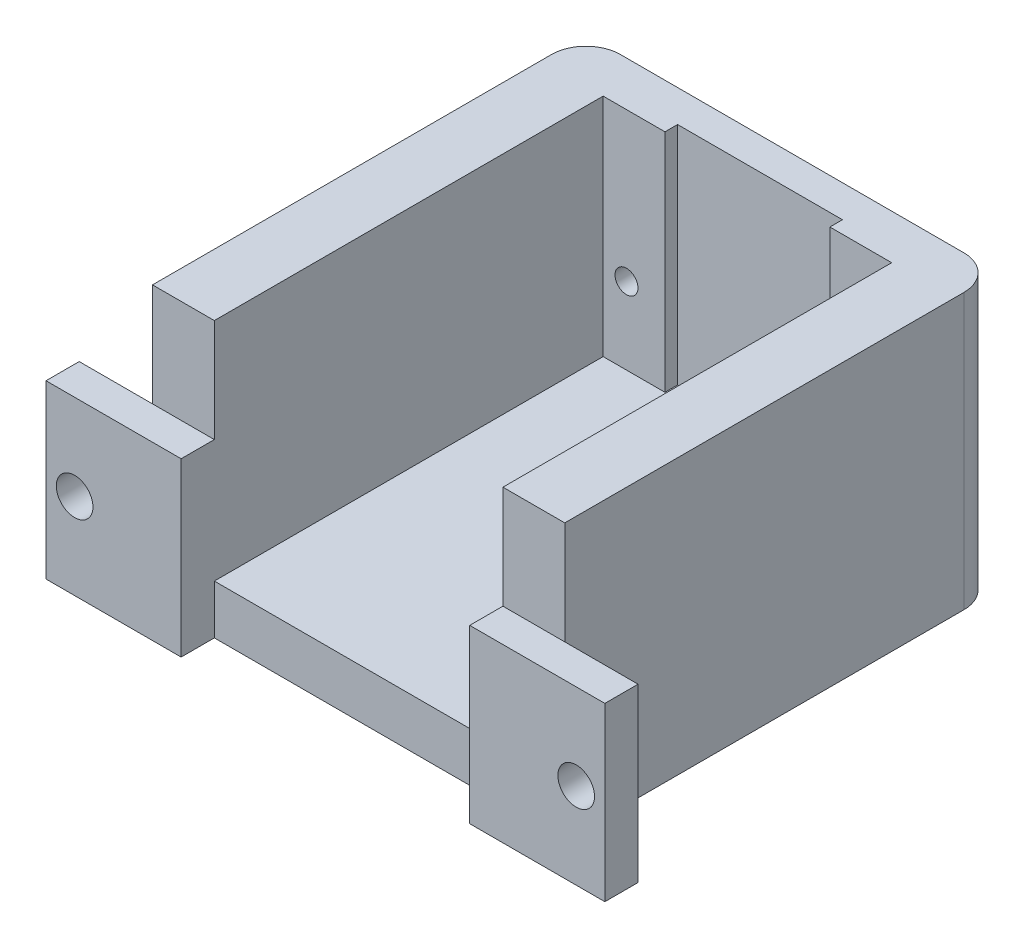
ISO-10303-21;
HEADER;
FILE_DESCRIPTION(('STEP AP214'),'2;1');
FILE_NAME('part.step','',(''),(''),'','','');
FILE_SCHEMA(('AUTOMOTIVE_DESIGN { 1 0 10303 214 1 1 1 1 }'));
ENDSEC;
DATA;
#1=APPLICATION_CONTEXT('core data for automotive mechanical design processes');
#2=APPLICATION_PROTOCOL_DEFINITION('international standard','automotive_design',2000,#1);
#3=PRODUCT_CONTEXT('',#1,'mechanical');
#4=PRODUCT('Part','Part','',(#3));
#5=PRODUCT_RELATED_PRODUCT_CATEGORY('part','',(#4));
#6=PRODUCT_DEFINITION_FORMATION('','',#4);
#7=PRODUCT_DEFINITION_CONTEXT('part definition',#1,'design');
#8=PRODUCT_DEFINITION('design','',#6,#7);
#9=PRODUCT_DEFINITION_SHAPE('','',#8);
#10=(LENGTH_UNIT() NAMED_UNIT(*) SI_UNIT(.MILLI.,.METRE.));
#11=(NAMED_UNIT(*) PLANE_ANGLE_UNIT() SI_UNIT($,.RADIAN.));
#12=(NAMED_UNIT(*) SI_UNIT($,.STERADIAN.) SOLID_ANGLE_UNIT());
#13=UNCERTAINTY_MEASURE_WITH_UNIT(LENGTH_MEASURE(1.E-05),#10,'distance_accuracy_value','');
#14=(GEOMETRIC_REPRESENTATION_CONTEXT(3) GLOBAL_UNCERTAINTY_ASSIGNED_CONTEXT((#13)) GLOBAL_UNIT_ASSIGNED_CONTEXT((#10,
#11,#12)) REPRESENTATION_CONTEXT('',''));
#15=CARTESIAN_POINT('',(0.,0.,0.));
#16=DIRECTION('',(0.,0.,1.));
#17=DIRECTION('',(1.,0.,0.));
#18=AXIS2_PLACEMENT_3D('',#15,#16,#17);
#19=CARTESIAN_POINT('',(-9.29999999999999,9.3,17.85));
#20=DIRECTION('',(0.,0.,1.));
#21=DIRECTION('',(1.,0.,0.));
#22=AXIS2_PLACEMENT_3D('',#19,#20,#21);
#23=PLANE('',#22);
#24=DIRECTION('',(1.,0.,0.));
#25=VECTOR('',#24,1.);
#26=CARTESIAN_POINT('',(-12.4,4.3,17.85));
#27=LINE('',#26,#25);
#28=CARTESIAN_POINT('',(-12.6,4.3,17.85));
#29=VERTEX_POINT('',#28);
#30=CARTESIAN_POINT('',(12.6,4.3,17.85));
#31=VERTEX_POINT('',#30);
#32=EDGE_CURVE('E190',#29,#31,#27,.T.);
#33=ORIENTED_EDGE('',*,*,#32,.F.);
#34=DIRECTION('',(0.,1.,0.));
#35=VECTOR('',#34,1.);
#36=CARTESIAN_POINT('',(-12.6,-25.3663162481272,17.85));
#37=LINE('',#36,#35);
#38=CARTESIAN_POINT('',(-12.6,0.,17.85));
#39=VERTEX_POINT('',#38);
#40=EDGE_CURVE('E192',#39,#29,#37,.T.);
#41=ORIENTED_EDGE('',*,*,#40,.F.);
#42=DIRECTION('',(-1.,0.,0.));
#43=VECTOR('',#42,1.);
#44=CARTESIAN_POINT('',(0.,0.,17.85));
#45=LINE('',#44,#43);
#46=CARTESIAN_POINT('',(12.6,0.,17.85));
#47=VERTEX_POINT('',#46);
#48=EDGE_CURVE('E344',#47,#39,#45,.T.);
#49=ORIENTED_EDGE('',*,*,#48,.F.);
#50=DIRECTION('',(0.,1.,0.));
#51=VECTOR('',#50,1.);
#52=CARTESIAN_POINT('',(12.6,-25.3663162481272,17.85));
#53=LINE('',#52,#51);
#54=EDGE_CURVE('E194',#47,#31,#53,.T.);
#55=ORIENTED_EDGE('',*,*,#54,.T.);
#56=EDGE_LOOP('',(#33,#41,#49,#55));
#57=FACE_BOUND('',#56,.T.);
#58=ADVANCED_FACE('F34',(#57),#23,.T.);
#59=DIRECTION('',(0.,-1.,0.));
#60=VECTOR('',#59,1.);
#61=CARTESIAN_POINT('',(-12.6,9.3,17.85));
#62=LINE('',#61,#60);
#63=CARTESIAN_POINT('',(-12.6,24.,17.85));
#64=VERTEX_POINT('',#63);
#65=CARTESIAN_POINT('',(-12.6,15.,17.85));
#66=VERTEX_POINT('',#65);
#67=EDGE_CURVE('E412',#64,#66,#62,.T.);
#68=ORIENTED_EDGE('',*,*,#67,.F.);
#69=DIRECTION('',(-1.,0.,0.));
#70=VECTOR('',#69,1.);
#71=CARTESIAN_POINT('',(0.,24.,17.85));
#72=LINE('',#71,#70);
#73=CARTESIAN_POINT('',(-18.,24.,17.85));
#74=VERTEX_POINT('',#73);
#75=EDGE_CURVE('E198',#64,#74,#72,.T.);
#76=ORIENTED_EDGE('',*,*,#75,.T.);
#77=DIRECTION('',(0.,-1.,0.));
#78=VECTOR('',#77,1.);
#79=CARTESIAN_POINT('',(-18.,24.,17.85));
#80=LINE('',#79,#78);
#81=CARTESIAN_POINT('',(-18.,15.,17.85));
#82=VERTEX_POINT('',#81);
#83=EDGE_CURVE('E346',#74,#82,#80,.T.);
#84=ORIENTED_EDGE('',*,*,#83,.T.);
#85=DIRECTION('',(1.,0.,0.));
#86=VECTOR('',#85,1.);
#87=CARTESIAN_POINT('',(-12.4,15.,17.85));
#88=LINE('',#87,#86);
#89=EDGE_CURVE('E394',#82,#66,#88,.T.);
#90=ORIENTED_EDGE('',*,*,#89,.T.);
#91=EDGE_LOOP('',(#68,#76,#84,#90));
#92=FACE_BOUND('',#91,.T.);
#93=ADVANCED_FACE('F443',(#92),#23,.T.);
#94=CARTESIAN_POINT('',(0.,24.,0.));
#95=DIRECTION('',(0.,-1.,0.));
#96=DIRECTION('',(0.,0.,-1.));
#97=AXIS2_PLACEMENT_3D('',#94,#95,#96);
#98=PLANE('',#97);
#99=DIRECTION('',(0.,0.,-1.));
#100=VECTOR('',#99,1.);
#101=CARTESIAN_POINT('',(18.,24.,25.));
#102=LINE('',#101,#100);
#103=CARTESIAN_POINT('',(18.,24.,17.85));
#104=VERTEX_POINT('',#103);
#105=CARTESIAN_POINT('',(18.,24.,-17.));
#106=VERTEX_POINT('',#105);
#107=EDGE_CURVE('E290',#104,#106,#102,.T.);
#108=ORIENTED_EDGE('',*,*,#107,.T.);
#109=CARTESIAN_POINT('',(15.,24.,-17.));
#110=DIRECTION('',(0.,-1.,0.));
#111=DIRECTION('',(0.,0.,-1.));
#112=AXIS2_PLACEMENT_3D('',#109,#110,#111);
#113=CIRCLE('',#112,3.);
#114=CARTESIAN_POINT('',(15.,24.,-20.));
#115=VERTEX_POINT('',#114);
#116=EDGE_CURVE('E42',#106,#115,#113,.F.);
#117=ORIENTED_EDGE('',*,*,#116,.T.);
#118=DIRECTION('',(1.,0.,0.));
#119=VECTOR('',#118,1.);
#120=CARTESIAN_POINT('',(0.,24.,-20.));
#121=LINE('',#120,#119);
#122=CARTESIAN_POINT('',(-15.,24.,-20.));
#123=VERTEX_POINT('',#122);
#124=EDGE_CURVE('E274',#123,#115,#121,.T.);
#125=ORIENTED_EDGE('',*,*,#124,.F.);
#126=CARTESIAN_POINT('',(-15.,24.,-17.));
#127=DIRECTION('',(0.,-1.,0.));
#128=DIRECTION('',(0.,0.,-1.));
#129=AXIS2_PLACEMENT_3D('',#126,#127,#128);
#130=CIRCLE('',#129,3.);
#131=CARTESIAN_POINT('',(-18.,24.,-17.));
#132=VERTEX_POINT('',#131);
#133=EDGE_CURVE('E49',#123,#132,#130,.F.);
#134=ORIENTED_EDGE('',*,*,#133,.T.);
#135=DIRECTION('',(0.,0.,1.));
#136=VECTOR('',#135,1.);
#137=CARTESIAN_POINT('',(-18.,24.,25.));
#138=LINE('',#137,#136);
#139=EDGE_CURVE('E292',#132,#74,#138,.T.);
#140=ORIENTED_EDGE('',*,*,#139,.T.);
#141=ORIENTED_EDGE('',*,*,#75,.F.);
#142=DIRECTION('',(0.,0.,1.));
#143=VECTOR('',#142,1.);
#144=CARTESIAN_POINT('',(-12.6,24.,-16.1));
#145=LINE('',#144,#143);
#146=CARTESIAN_POINT('',(-12.6,24.,-16.1));
#147=VERTEX_POINT('',#146);
#148=EDGE_CURVE('E238',#147,#64,#145,.T.);
#149=ORIENTED_EDGE('',*,*,#148,.F.);
#150=DIRECTION('',(-1.,0.,0.));
#151=VECTOR('',#150,1.);
#152=CARTESIAN_POINT('',(-7.2,24.,-16.1));
#153=LINE('',#152,#151);
#154=CARTESIAN_POINT('',(-7.2,24.,-16.1));
#155=VERTEX_POINT('',#154);
#156=EDGE_CURVE('E215',#155,#147,#153,.T.);
#157=ORIENTED_EDGE('',*,*,#156,.F.);
#158=DIRECTION('',(0.,0.,1.));
#159=VECTOR('',#158,1.);
#160=CARTESIAN_POINT('',(-7.2,24.,-17.2));
#161=LINE('',#160,#159);
#162=CARTESIAN_POINT('',(-7.2,24.,-17.2));
#163=VERTEX_POINT('',#162);
#164=EDGE_CURVE('E220',#163,#155,#161,.T.);
#165=ORIENTED_EDGE('',*,*,#164,.F.);
#166=DIRECTION('',(-1.,0.,0.));
#167=VECTOR('',#166,1.);
#168=CARTESIAN_POINT('',(7.2,24.,-17.2));
#169=LINE('',#168,#167);
#170=CARTESIAN_POINT('',(7.2,24.,-17.2));
#171=VERTEX_POINT('',#170);
#172=EDGE_CURVE('E250',#171,#163,#169,.T.);
#173=ORIENTED_EDGE('',*,*,#172,.F.);
#174=DIRECTION('',(0.,0.,-1.));
#175=VECTOR('',#174,1.);
#176=CARTESIAN_POINT('',(7.2,24.,-16.1));
#177=LINE('',#176,#175);
#178=CARTESIAN_POINT('',(7.2,24.,-16.1));
#179=VERTEX_POINT('',#178);
#180=EDGE_CURVE('E247',#179,#171,#177,.T.);
#181=ORIENTED_EDGE('',*,*,#180,.F.);
#182=DIRECTION('',(-1.,0.,0.));
#183=VECTOR('',#182,1.);
#184=CARTESIAN_POINT('',(12.6,24.,-16.1));
#185=LINE('',#184,#183);
#186=CARTESIAN_POINT('',(12.6,24.,-16.1));
#187=VERTEX_POINT('',#186);
#188=EDGE_CURVE('E244',#187,#179,#185,.T.);
#189=ORIENTED_EDGE('',*,*,#188,.F.);
#190=DIRECTION('',(0.,0.,-1.));
#191=VECTOR('',#190,1.);
#192=CARTESIAN_POINT('',(12.6,24.,16.1));
#193=LINE('',#192,#191);
#194=CARTESIAN_POINT('',(12.6,24.,17.85));
#195=VERTEX_POINT('',#194);
#196=EDGE_CURVE('E240',#195,#187,#193,.T.);
#197=ORIENTED_EDGE('',*,*,#196,.F.);
#198=EDGE_CURVE('E241',#104,#195,#72,.T.);
#199=ORIENTED_EDGE('',*,*,#198,.F.);
#200=EDGE_LOOP('',(#108,#117,#125,#134,#140,#141,#149,#157,#165,#173,#181,#189,#197,#199));
#201=FACE_BOUND('',#200,.T.);
#202=ADVANCED_FACE('F322',(#201),#98,.F.);
#203=CARTESIAN_POINT('',(18.,24.,25.));
#204=DIRECTION('',(-1.,0.,0.));
#205=DIRECTION('',(0.,0.,1.));
#206=AXIS2_PLACEMENT_3D('',#203,#204,#205);
#207=PLANE('',#206);
#208=DIRECTION('',(0.,0.,-1.));
#209=VECTOR('',#208,1.);
#210=CARTESIAN_POINT('',(18.,0.,25.));
#211=LINE('',#210,#209);
#212=CARTESIAN_POINT('',(18.,0.,17.85));
#213=VERTEX_POINT('',#212);
#214=CARTESIAN_POINT('',(18.,0.,-17.));
#215=VERTEX_POINT('',#214);
#216=EDGE_CURVE('E287',#213,#215,#211,.T.);
#217=ORIENTED_EDGE('',*,*,#216,.T.);
#218=DIRECTION('',(0.,-1.,0.));
#219=VECTOR('',#218,1.);
#220=CARTESIAN_POINT('',(18.,24.,-17.));
#221=LINE('',#220,#219);
#222=EDGE_CURVE('E57',#215,#106,#221,.F.);
#223=ORIENTED_EDGE('',*,*,#222,.T.);
#224=ORIENTED_EDGE('',*,*,#107,.F.);
#225=DIRECTION('',(0.,1.,0.));
#226=VECTOR('',#225,1.);
#227=CARTESIAN_POINT('',(18.,24.,17.85));
#228=LINE('',#227,#226);
#229=CARTESIAN_POINT('',(18.,15.,17.85));
#230=VERTEX_POINT('',#229);
#231=EDGE_CURVE('E338',#230,#104,#228,.T.);
#232=ORIENTED_EDGE('',*,*,#231,.F.);
#233=EDGE_CURVE('E223',#213,#230,#228,.T.);
#234=ORIENTED_EDGE('',*,*,#233,.F.);
#235=EDGE_LOOP('',(#217,#223,#224,#232,#234));
#236=FACE_BOUND('',#235,.T.);
#237=ADVANCED_FACE('F335',(#236),#207,.F.);
#238=CARTESIAN_POINT('',(-18.,24.,25.));
#239=DIRECTION('',(1.,0.,0.));
#240=DIRECTION('',(0.,0.,-1.));
#241=AXIS2_PLACEMENT_3D('',#238,#239,#240);
#242=PLANE('',#241);
#243=ORIENTED_EDGE('',*,*,#139,.F.);
#244=DIRECTION('',(0.,1.,0.));
#245=VECTOR('',#244,1.);
#246=CARTESIAN_POINT('',(-18.,0.,-17.));
#247=LINE('',#246,#245);
#248=CARTESIAN_POINT('',(-18.,0.,-17.));
#249=VERTEX_POINT('',#248);
#250=EDGE_CURVE('E11',#132,#249,#247,.F.);
#251=ORIENTED_EDGE('',*,*,#250,.T.);
#252=DIRECTION('',(0.,0.,1.));
#253=VECTOR('',#252,1.);
#254=CARTESIAN_POINT('',(-18.,0.,25.));
#255=LINE('',#254,#253);
#256=CARTESIAN_POINT('',(-18.,0.,17.85));
#257=VERTEX_POINT('',#256);
#258=EDGE_CURVE('E293',#249,#257,#255,.T.);
#259=ORIENTED_EDGE('',*,*,#258,.T.);
#260=DIRECTION('',(0.,-1.,0.));
#261=VECTOR('',#260,1.);
#262=CARTESIAN_POINT('',(-18.,24.,17.85));
#263=LINE('',#262,#261);
#264=EDGE_CURVE('E374',#82,#257,#263,.T.);
#265=ORIENTED_EDGE('',*,*,#264,.F.);
#266=ORIENTED_EDGE('',*,*,#83,.F.);
#267=EDGE_LOOP('',(#243,#251,#259,#265,#266));
#268=FACE_BOUND('',#267,.T.);
#269=ADVANCED_FACE('F438',(#268),#242,.F.);
#270=CARTESIAN_POINT('',(0.,0.,0.));
#271=DIRECTION('',(0.,-1.,0.));
#272=DIRECTION('',(0.,0.,-1.));
#273=AXIS2_PLACEMENT_3D('',#270,#271,#272);
#274=PLANE('',#273);
#275=DIRECTION('',(1.,0.,0.));
#276=VECTOR('',#275,1.);
#277=CARTESIAN_POINT('',(0.,0.,-20.));
#278=LINE('',#277,#276);
#279=CARTESIAN_POINT('',(-15.,0.,-20.));
#280=VERTEX_POINT('',#279);
#281=CARTESIAN_POINT('',(15.,0.,-20.));
#282=VERTEX_POINT('',#281);
#283=EDGE_CURVE('E270',#280,#282,#278,.T.);
#284=ORIENTED_EDGE('',*,*,#283,.T.);
#285=CARTESIAN_POINT('',(15.,0.,-17.));
#286=DIRECTION('',(0.,-1.,0.));
#287=DIRECTION('',(0.,0.,-1.));
#288=AXIS2_PLACEMENT_3D('',#285,#286,#287);
#289=CIRCLE('',#288,3.);
#290=EDGE_CURVE('E318',#282,#215,#289,.T.);
#291=ORIENTED_EDGE('',*,*,#290,.T.);
#292=ORIENTED_EDGE('',*,*,#216,.F.);
#293=DIRECTION('',(1.,0.,0.));
#294=VECTOR('',#293,1.);
#295=CARTESIAN_POINT('',(12.4,0.,17.85));
#296=LINE('',#295,#294);
#297=CARTESIAN_POINT('',(24.4,0.,17.85));
#298=VERTEX_POINT('',#297);
#299=EDGE_CURVE('E363',#213,#298,#296,.T.);
#300=ORIENTED_EDGE('',*,*,#299,.T.);
#301=DIRECTION('',(0.,0.,-1.));
#302=VECTOR('',#301,1.);
#303=CARTESIAN_POINT('',(24.4,0.,20.75));
#304=LINE('',#303,#302);
#305=CARTESIAN_POINT('',(24.4,0.,20.75));
#306=VERTEX_POINT('',#305);
#307=EDGE_CURVE('E199',#306,#298,#304,.T.);
#308=ORIENTED_EDGE('',*,*,#307,.F.);
#309=DIRECTION('',(1.,0.,0.));
#310=VECTOR('',#309,1.);
#311=CARTESIAN_POINT('',(12.4,0.,20.75));
#312=LINE('',#311,#310);
#313=CARTESIAN_POINT('',(12.6,0.,20.75));
#314=VERTEX_POINT('',#313);
#315=EDGE_CURVE('E360',#314,#306,#312,.T.);
#316=ORIENTED_EDGE('',*,*,#315,.F.);
#317=DIRECTION('',(0.,0.,-1.));
#318=VECTOR('',#317,1.);
#319=CARTESIAN_POINT('',(12.6,0.,17.85));
#320=LINE('',#319,#318);
#321=EDGE_CURVE('E416',#314,#47,#320,.T.);
#322=ORIENTED_EDGE('',*,*,#321,.T.);
#323=ORIENTED_EDGE('',*,*,#48,.T.);
#324=DIRECTION('',(0.,0.,1.));
#325=VECTOR('',#324,1.);
#326=CARTESIAN_POINT('',(-12.6,0.,17.85));
#327=LINE('',#326,#325);
#328=CARTESIAN_POINT('',(-12.6,0.,20.75));
#329=VERTEX_POINT('',#328);
#330=EDGE_CURVE('E208',#39,#329,#327,.T.);
#331=ORIENTED_EDGE('',*,*,#330,.T.);
#332=DIRECTION('',(-1.,0.,0.));
#333=VECTOR('',#332,1.);
#334=CARTESIAN_POINT('',(-12.4,0.,20.75));
#335=LINE('',#334,#333);
#336=CARTESIAN_POINT('',(-24.4,0.,20.75));
#337=VERTEX_POINT('',#336);
#338=EDGE_CURVE('E384',#329,#337,#335,.T.);
#339=ORIENTED_EDGE('',*,*,#338,.T.);
#340=DIRECTION('',(0.,0.,-1.));
#341=VECTOR('',#340,1.);
#342=CARTESIAN_POINT('',(-24.4,0.,20.75));
#343=LINE('',#342,#341);
#344=CARTESIAN_POINT('',(-24.4,0.,17.85));
#345=VERTEX_POINT('',#344);
#346=EDGE_CURVE('E381',#337,#345,#343,.T.);
#347=ORIENTED_EDGE('',*,*,#346,.T.);
#348=DIRECTION('',(-1.,0.,0.));
#349=VECTOR('',#348,1.);
#350=CARTESIAN_POINT('',(-12.4,0.,17.85));
#351=LINE('',#350,#349);
#352=EDGE_CURVE('E385',#257,#345,#351,.T.);
#353=ORIENTED_EDGE('',*,*,#352,.F.);
#354=ORIENTED_EDGE('',*,*,#258,.F.);
#355=CARTESIAN_POINT('',(-15.,0.,-17.));
#356=DIRECTION('',(0.,-1.,0.));
#357=DIRECTION('',(0.,0.,-1.));
#358=AXIS2_PLACEMENT_3D('',#355,#356,#357);
#359=CIRCLE('',#358,3.);
#360=EDGE_CURVE('E316',#249,#280,#359,.T.);
#361=ORIENTED_EDGE('',*,*,#360,.T.);
#362=EDGE_LOOP('',(#284,#291,#292,#300,#308,#316,#322,#323,#331,#339,#347,#353,#354,#361));
#363=FACE_BOUND('',#362,.T.);
#364=ADVANCED_FACE('F333',(#363),#274,.T.);
#365=CARTESIAN_POINT('',(-10.56,11.,-17.6));
#366=DIRECTION('',(0.,0.,-1.));
#367=DIRECTION('',(-1.,0.,0.));
#368=AXIS2_PLACEMENT_3D('',#365,#366,#367);
#369=CYLINDRICAL_SURFACE('',#368,2.);
#370=CARTESIAN_POINT('',(-10.56,11.,-17.6));
#371=DIRECTION('',(0.,0.,-1.));
#372=DIRECTION('',(-1.,0.,0.));
#373=AXIS2_PLACEMENT_3D('',#370,#371,#372);
#374=CIRCLE('',#373,2.);
#375=CARTESIAN_POINT('',(-12.56,11.,-17.6));
#376=VERTEX_POINT('',#375);
#377=EDGE_CURVE('E281',#376,#376,#374,.T.);
#378=ORIENTED_EDGE('',*,*,#377,.F.);
#379=EDGE_LOOP('',(#378));
#380=FACE_BOUND('',#379,.T.);
#381=CARTESIAN_POINT('',(-10.56,11.,-20.));
#382=DIRECTION('',(0.,0.,-1.));
#383=DIRECTION('',(-1.,0.,0.));
#384=AXIS2_PLACEMENT_3D('',#381,#382,#383);
#385=CIRCLE('',#384,2.);
#386=CARTESIAN_POINT('',(-12.56,11.,-20.));
#387=VERTEX_POINT('',#386);
#388=EDGE_CURVE('E267',#387,#387,#385,.F.);
#389=ORIENTED_EDGE('',*,*,#388,.F.);
#390=EDGE_LOOP('',(#389));
#391=FACE_BOUND('',#390,.T.);
#392=ADVANCED_FACE('F548',(#380,#391),#369,.F.);
#393=CARTESIAN_POINT('',(10.565,11.,-17.6));
#394=DIRECTION('',(0.,0.,-1.));
#395=DIRECTION('',(-1.,0.,0.));
#396=AXIS2_PLACEMENT_3D('',#393,#394,#395);
#397=CYLINDRICAL_SURFACE('',#396,2.);
#398=CARTESIAN_POINT('',(10.565,11.,-17.6));
#399=DIRECTION('',(0.,0.,-1.));
#400=DIRECTION('',(-1.,0.,0.));
#401=AXIS2_PLACEMENT_3D('',#398,#399,#400);
#402=CIRCLE('',#401,2.);
#403=CARTESIAN_POINT('',(8.56500000000001,11.,-17.6));
#404=VERTEX_POINT('',#403);
#405=EDGE_CURVE('E284',#404,#404,#402,.T.);
#406=ORIENTED_EDGE('',*,*,#405,.F.);
#407=EDGE_LOOP('',(#406));
#408=FACE_BOUND('',#407,.T.);
#409=CARTESIAN_POINT('',(10.565,11.,-20.));
#410=DIRECTION('',(0.,0.,-1.));
#411=DIRECTION('',(-1.,0.,0.));
#412=AXIS2_PLACEMENT_3D('',#409,#410,#411);
#413=CIRCLE('',#412,2.);
#414=CARTESIAN_POINT('',(8.56500000000001,11.,-20.));
#415=VERTEX_POINT('',#414);
#416=EDGE_CURVE('E271',#415,#415,#413,.F.);
#417=ORIENTED_EDGE('',*,*,#416,.F.);
#418=EDGE_LOOP('',(#417));
#419=FACE_BOUND('',#418,.T.);
#420=ADVANCED_FACE('F545',(#408,#419),#397,.F.);
#421=CARTESIAN_POINT('',(-10.56,11.,-17.6));
#422=DIRECTION('',(0.,0.,-1.));
#423=DIRECTION('',(-1.,0.,0.));
#424=AXIS2_PLACEMENT_3D('',#421,#422,#423);
#425=PLANE('',#424);
#426=CARTESIAN_POINT('',(-10.56,11.,-17.6));
#427=DIRECTION('',(0.,0.,-1.));
#428=DIRECTION('',(-1.,0.,0.));
#429=AXIS2_PLACEMENT_3D('',#426,#427,#428);
#430=CIRCLE('',#429,1.);
#431=CARTESIAN_POINT('',(-11.56,11.,-17.6));
#432=VERTEX_POINT('',#431);
#433=EDGE_CURVE('E278',#432,#432,#430,.T.);
#434=ORIENTED_EDGE('',*,*,#433,.F.);
#435=EDGE_LOOP('',(#434));
#436=FACE_BOUND('',#435,.T.);
#437=ORIENTED_EDGE('',*,*,#377,.T.);
#438=EDGE_LOOP('',(#437));
#439=FACE_BOUND('',#438,.T.);
#440=ADVANCED_FACE('F543',(#436,#439),#425,.T.);
#441=CARTESIAN_POINT('',(10.565,11.,-17.6));
#442=DIRECTION('',(0.,0.,-1.));
#443=DIRECTION('',(-1.,0.,0.));
#444=AXIS2_PLACEMENT_3D('',#441,#442,#443);
#445=PLANE('',#444);
#446=CARTESIAN_POINT('',(10.565,11.,-17.6));
#447=DIRECTION('',(0.,0.,-1.));
#448=DIRECTION('',(-1.,0.,0.));
#449=AXIS2_PLACEMENT_3D('',#446,#447,#448);
#450=CIRCLE('',#449,1.);
#451=CARTESIAN_POINT('',(9.56500000000001,11.,-17.6));
#452=VERTEX_POINT('',#451);
#453=EDGE_CURVE('E277',#452,#452,#450,.T.);
#454=ORIENTED_EDGE('',*,*,#453,.F.);
#455=EDGE_LOOP('',(#454));
#456=FACE_BOUND('',#455,.T.);
#457=ORIENTED_EDGE('',*,*,#405,.T.);
#458=EDGE_LOOP('',(#457));
#459=FACE_BOUND('',#458,.T.);
#460=ADVANCED_FACE('F539',(#456,#459),#445,.T.);
#461=CARTESIAN_POINT('',(10.565,11.,-10.2));
#462=DIRECTION('',(0.,0.,-1.));
#463=DIRECTION('',(-1.,0.,0.));
#464=AXIS2_PLACEMENT_3D('',#461,#462,#463);
#465=CYLINDRICAL_SURFACE('',#464,1.);
#466=CARTESIAN_POINT('',(10.565,11.,-16.1));
#467=DIRECTION('',(0.,0.,-1.));
#468=DIRECTION('',(-1.,0.,0.));
#469=AXIS2_PLACEMENT_3D('',#466,#467,#468);
#470=CIRCLE('',#469,1.);
#471=CARTESIAN_POINT('',(9.56500000000001,11.,-16.1));
#472=VERTEX_POINT('',#471);
#473=EDGE_CURVE('E300',#472,#472,#470,.F.);
#474=ORIENTED_EDGE('',*,*,#473,.T.);
#475=EDGE_LOOP('',(#474));
#476=FACE_BOUND('',#475,.T.);
#477=ORIENTED_EDGE('',*,*,#453,.T.);
#478=EDGE_LOOP('',(#477));
#479=FACE_BOUND('',#478,.T.);
#480=ADVANCED_FACE('F535',(#476,#479),#465,.F.);
#481=CARTESIAN_POINT('',(-10.56,11.,-10.2));
#482=DIRECTION('',(0.,0.,-1.));
#483=DIRECTION('',(-1.,0.,0.));
#484=AXIS2_PLACEMENT_3D('',#481,#482,#483);
#485=CYLINDRICAL_SURFACE('',#484,1.);
#486=CARTESIAN_POINT('',(-10.56,11.,-16.1));
#487=DIRECTION('',(0.,0.,-1.));
#488=DIRECTION('',(-1.,0.,0.));
#489=AXIS2_PLACEMENT_3D('',#486,#487,#488);
#490=CIRCLE('',#489,1.);
#491=CARTESIAN_POINT('',(-11.56,11.,-16.1));
#492=VERTEX_POINT('',#491);
#493=EDGE_CURVE('E257',#492,#492,#490,.F.);
#494=ORIENTED_EDGE('',*,*,#493,.T.);
#495=EDGE_LOOP('',(#494));
#496=FACE_BOUND('',#495,.T.);
#497=ORIENTED_EDGE('',*,*,#433,.T.);
#498=EDGE_LOOP('',(#497));
#499=FACE_BOUND('',#498,.T.);
#500=ADVANCED_FACE('F531',(#496,#499),#485,.F.);
#501=CARTESIAN_POINT('',(0.,0.,-20.));
#502=DIRECTION('',(0.,0.,-1.));
#503=DIRECTION('',(-1.,0.,0.));
#504=AXIS2_PLACEMENT_3D('',#501,#502,#503);
#505=PLANE('',#504);
#506=ORIENTED_EDGE('',*,*,#388,.T.);
#507=EDGE_LOOP('',(#506));
#508=FACE_BOUND('',#507,.T.);
#509=ORIENTED_EDGE('',*,*,#416,.T.);
#510=EDGE_LOOP('',(#509));
#511=FACE_BOUND('',#510,.T.);
#512=ORIENTED_EDGE('',*,*,#124,.T.);
#513=DIRECTION('',(0.,-1.,0.));
#514=VECTOR('',#513,1.);
#515=CARTESIAN_POINT('',(15.,0.,-20.));
#516=LINE('',#515,#514);
#517=EDGE_CURVE('E313',#115,#282,#516,.T.);
#518=ORIENTED_EDGE('',*,*,#517,.T.);
#519=ORIENTED_EDGE('',*,*,#283,.F.);
#520=DIRECTION('',(0.,1.,0.));
#521=VECTOR('',#520,1.);
#522=CARTESIAN_POINT('',(-15.,24.,-20.));
#523=LINE('',#522,#521);
#524=EDGE_CURVE('E310',#280,#123,#523,.T.);
#525=ORIENTED_EDGE('',*,*,#524,.T.);
#526=EDGE_LOOP('',(#512,#518,#519,#525));
#527=FACE_BOUND('',#526,.T.);
#528=ADVANCED_FACE('F327',(#508,#511,#527),#505,.T.);
#529=CARTESIAN_POINT('',(12.6,4.3,-16.1));
#530=DIRECTION('',(0.,0.,-1.));
#531=DIRECTION('',(-1.,0.,0.));
#532=AXIS2_PLACEMENT_3D('',#529,#530,#531);
#533=PLANE('',#532);
#534=ORIENTED_EDGE('',*,*,#188,.T.);
#535=DIRECTION('',(0.,1.,0.));
#536=VECTOR('',#535,1.);
#537=CARTESIAN_POINT('',(7.2,4.3,-16.1));
#538=LINE('',#537,#536);
#539=CARTESIAN_POINT('',(7.2,4.3,-16.1));
#540=VERTEX_POINT('',#539);
#541=EDGE_CURVE('E264',#540,#179,#538,.T.);
#542=ORIENTED_EDGE('',*,*,#541,.F.);
#543=DIRECTION('',(-1.,0.,0.));
#544=VECTOR('',#543,1.);
#545=CARTESIAN_POINT('',(12.6,4.3,-16.1));
#546=LINE('',#545,#544);
#547=CARTESIAN_POINT('',(12.6,4.3,-16.1));
#548=VERTEX_POINT('',#547);
#549=EDGE_CURVE('E217',#548,#540,#546,.T.);
#550=ORIENTED_EDGE('',*,*,#549,.F.);
#551=DIRECTION('',(0.,1.,0.));
#552=VECTOR('',#551,1.);
#553=CARTESIAN_POINT('',(12.6,4.3,-16.1));
#554=LINE('',#553,#552);
#555=EDGE_CURVE('E237',#548,#187,#554,.T.);
#556=ORIENTED_EDGE('',*,*,#555,.T.);
#557=EDGE_LOOP('',(#534,#542,#550,#556));
#558=FACE_BOUND('',#557,.T.);
#559=ORIENTED_EDGE('',*,*,#473,.F.);
#560=EDGE_LOOP('',(#559));
#561=FACE_BOUND('',#560,.T.);
#562=ADVANCED_FACE('F497',(#558,#561),#533,.F.);
#563=CARTESIAN_POINT('',(-7.2,4.3,-16.1));
#564=DIRECTION('',(0.,0.,-1.));
#565=DIRECTION('',(-1.,0.,0.));
#566=AXIS2_PLACEMENT_3D('',#563,#564,#565);
#567=PLANE('',#566);
#568=ORIENTED_EDGE('',*,*,#156,.T.);
#569=DIRECTION('',(0.,1.,0.));
#570=VECTOR('',#569,1.);
#571=CARTESIAN_POINT('',(-12.6,4.3,-16.1));
#572=LINE('',#571,#570);
#573=CARTESIAN_POINT('',(-12.6,4.3,-16.1));
#574=VERTEX_POINT('',#573);
#575=EDGE_CURVE('E255',#574,#147,#572,.T.);
#576=ORIENTED_EDGE('',*,*,#575,.F.);
#577=DIRECTION('',(-1.,0.,0.));
#578=VECTOR('',#577,1.);
#579=CARTESIAN_POINT('',(-7.2,4.3,-16.1));
#580=LINE('',#579,#578);
#581=CARTESIAN_POINT('',(-7.2,4.3,-16.1));
#582=VERTEX_POINT('',#581);
#583=EDGE_CURVE('E213',#582,#574,#580,.T.);
#584=ORIENTED_EDGE('',*,*,#583,.F.);
#585=DIRECTION('',(0.,1.,0.));
#586=VECTOR('',#585,1.);
#587=CARTESIAN_POINT('',(-7.2,4.3,-16.1));
#588=LINE('',#587,#586);
#589=EDGE_CURVE('E258',#582,#155,#588,.T.);
#590=ORIENTED_EDGE('',*,*,#589,.T.);
#591=EDGE_LOOP('',(#568,#576,#584,#590));
#592=FACE_BOUND('',#591,.T.);
#593=ORIENTED_EDGE('',*,*,#493,.F.);
#594=EDGE_LOOP('',(#593));
#595=FACE_BOUND('',#594,.T.);
#596=ADVANCED_FACE('F510',(#592,#595),#567,.F.);
#597=CARTESIAN_POINT('',(-12.6,4.3,-16.1));
#598=DIRECTION('',(-1.,0.,0.));
#599=DIRECTION('',(0.,0.,1.));
#600=AXIS2_PLACEMENT_3D('',#597,#598,#599);
#601=PLANE('',#600);
#602=ORIENTED_EDGE('',*,*,#148,.T.);
#603=ORIENTED_EDGE('',*,*,#67,.T.);
#604=DIRECTION('',(0.,0.,1.));
#605=VECTOR('',#604,1.);
#606=CARTESIAN_POINT('',(-12.6,15.,20.75));
#607=LINE('',#606,#605);
#608=CARTESIAN_POINT('',(-12.6,15.,20.75));
#609=VERTEX_POINT('',#608);
#610=EDGE_CURVE('E414',#66,#609,#607,.T.);
#611=ORIENTED_EDGE('',*,*,#610,.T.);
#612=DIRECTION('',(0.,-1.,0.));
#613=VECTOR('',#612,1.);
#614=CARTESIAN_POINT('',(-12.6,0.,20.75));
#615=LINE('',#614,#613);
#616=EDGE_CURVE('E305',#609,#329,#615,.T.);
#617=ORIENTED_EDGE('',*,*,#616,.T.);
#618=ORIENTED_EDGE('',*,*,#330,.F.);
#619=ORIENTED_EDGE('',*,*,#40,.T.);
#620=DIRECTION('',(0.,0.,1.));
#621=VECTOR('',#620,1.);
#622=CARTESIAN_POINT('',(-12.6,4.3,-16.1));
#623=LINE('',#622,#621);
#624=EDGE_CURVE('E205',#574,#29,#623,.T.);
#625=ORIENTED_EDGE('',*,*,#624,.F.);
#626=ORIENTED_EDGE('',*,*,#575,.T.);
#627=EDGE_LOOP('',(#602,#603,#611,#617,#618,#619,#625,#626));
#628=FACE_BOUND('',#627,.T.);
#629=ADVANCED_FACE('F204',(#628),#601,.F.);
#630=CARTESIAN_POINT('',(-7.2,4.3,-17.2));
#631=DIRECTION('',(-1.,0.,0.));
#632=DIRECTION('',(0.,0.,1.));
#633=AXIS2_PLACEMENT_3D('',#630,#631,#632);
#634=PLANE('',#633);
#635=ORIENTED_EDGE('',*,*,#164,.T.);
#636=ORIENTED_EDGE('',*,*,#589,.F.);
#637=DIRECTION('',(0.,0.,1.));
#638=VECTOR('',#637,1.);
#639=CARTESIAN_POINT('',(-7.2,4.3,-17.2));
#640=LINE('',#639,#638);
#641=CARTESIAN_POINT('',(-7.2,4.3,-17.2));
#642=VERTEX_POINT('',#641);
#643=EDGE_CURVE('E234',#642,#582,#640,.T.);
#644=ORIENTED_EDGE('',*,*,#643,.F.);
#645=DIRECTION('',(0.,1.,0.));
#646=VECTOR('',#645,1.);
#647=CARTESIAN_POINT('',(-7.2,4.3,-17.2));
#648=LINE('',#647,#646);
#649=EDGE_CURVE('E260',#642,#163,#648,.T.);
#650=ORIENTED_EDGE('',*,*,#649,.T.);
#651=EDGE_LOOP('',(#635,#636,#644,#650));
#652=FACE_BOUND('',#651,.T.);
#653=ADVANCED_FACE('F513',(#652),#634,.F.);
#654=CARTESIAN_POINT('',(7.2,4.3,-17.2));
#655=DIRECTION('',(0.,0.,-1.));
#656=DIRECTION('',(-1.,0.,0.));
#657=AXIS2_PLACEMENT_3D('',#654,#655,#656);
#658=PLANE('',#657);
#659=ORIENTED_EDGE('',*,*,#172,.T.);
#660=ORIENTED_EDGE('',*,*,#649,.F.);
#661=DIRECTION('',(-1.,0.,0.));
#662=VECTOR('',#661,1.);
#663=CARTESIAN_POINT('',(7.2,4.3,-17.2));
#664=LINE('',#663,#662);
#665=CARTESIAN_POINT('',(7.2,4.3,-17.2));
#666=VERTEX_POINT('',#665);
#667=EDGE_CURVE('E231',#666,#642,#664,.T.);
#668=ORIENTED_EDGE('',*,*,#667,.F.);
#669=DIRECTION('',(0.,1.,0.));
#670=VECTOR('',#669,1.);
#671=CARTESIAN_POINT('',(7.2,4.3,-17.2));
#672=LINE('',#671,#670);
#673=EDGE_CURVE('E262',#666,#171,#672,.T.);
#674=ORIENTED_EDGE('',*,*,#673,.T.);
#675=EDGE_LOOP('',(#659,#660,#668,#674));
#676=FACE_BOUND('',#675,.T.);
#677=ADVANCED_FACE('F506',(#676),#658,.F.);
#678=CARTESIAN_POINT('',(7.2,4.3,-16.1));
#679=DIRECTION('',(1.,0.,0.));
#680=DIRECTION('',(0.,0.,-1.));
#681=AXIS2_PLACEMENT_3D('',#678,#679,#680);
#682=PLANE('',#681);
#683=ORIENTED_EDGE('',*,*,#180,.T.);
#684=ORIENTED_EDGE('',*,*,#673,.F.);
#685=DIRECTION('',(0.,0.,-1.));
#686=VECTOR('',#685,1.);
#687=CARTESIAN_POINT('',(7.2,4.3,-16.1));
#688=LINE('',#687,#686);
#689=EDGE_CURVE('E228',#540,#666,#688,.T.);
#690=ORIENTED_EDGE('',*,*,#689,.F.);
#691=ORIENTED_EDGE('',*,*,#541,.T.);
#692=EDGE_LOOP('',(#683,#684,#690,#691));
#693=FACE_BOUND('',#692,.T.);
#694=ADVANCED_FACE('F502',(#693),#682,.F.);
#695=CARTESIAN_POINT('',(12.6,4.3,16.1));
#696=DIRECTION('',(1.,0.,0.));
#697=DIRECTION('',(0.,0.,-1.));
#698=AXIS2_PLACEMENT_3D('',#695,#696,#697);
#699=PLANE('',#698);
#700=ORIENTED_EDGE('',*,*,#196,.T.);
#701=ORIENTED_EDGE('',*,*,#555,.F.);
#702=DIRECTION('',(0.,0.,-1.));
#703=VECTOR('',#702,1.);
#704=CARTESIAN_POINT('',(12.6,4.3,16.1));
#705=LINE('',#704,#703);
#706=EDGE_CURVE('E214',#31,#548,#705,.T.);
#707=ORIENTED_EDGE('',*,*,#706,.F.);
#708=ORIENTED_EDGE('',*,*,#54,.F.);
#709=ORIENTED_EDGE('',*,*,#321,.F.);
#710=DIRECTION('',(0.,1.,0.));
#711=VECTOR('',#710,1.);
#712=CARTESIAN_POINT('',(12.6,0.,20.75));
#713=LINE('',#712,#711);
#714=CARTESIAN_POINT('',(12.6,15.,20.75));
#715=VERTEX_POINT('',#714);
#716=EDGE_CURVE('E410',#314,#715,#713,.T.);
#717=ORIENTED_EDGE('',*,*,#716,.T.);
#718=DIRECTION('',(0.,0.,1.));
#719=VECTOR('',#718,1.);
#720=CARTESIAN_POINT('',(12.6,15.,20.75));
#721=LINE('',#720,#719);
#722=CARTESIAN_POINT('',(12.6,15.,17.85));
#723=VERTEX_POINT('',#722);
#724=EDGE_CURVE('E307',#723,#715,#721,.T.);
#725=ORIENTED_EDGE('',*,*,#724,.F.);
#726=DIRECTION('',(0.,1.,0.));
#727=VECTOR('',#726,1.);
#728=CARTESIAN_POINT('',(12.6,9.3,17.85));
#729=LINE('',#728,#727);
#730=EDGE_CURVE('E405',#723,#195,#729,.T.);
#731=ORIENTED_EDGE('',*,*,#730,.T.);
#732=EDGE_LOOP('',(#700,#701,#707,#708,#709,#717,#725,#731));
#733=FACE_BOUND('',#732,.T.);
#734=ADVANCED_FACE('F475',(#733),#699,.F.);
#735=CARTESIAN_POINT('',(0.,4.3,0.));
#736=DIRECTION('',(0.,-1.,0.));
#737=DIRECTION('',(0.,0.,-1.));
#738=AXIS2_PLACEMENT_3D('',#735,#736,#737);
#739=PLANE('',#738);
#740=ORIENTED_EDGE('',*,*,#624,.T.);
#741=ORIENTED_EDGE('',*,*,#32,.T.);
#742=ORIENTED_EDGE('',*,*,#706,.T.);
#743=ORIENTED_EDGE('',*,*,#549,.T.);
#744=ORIENTED_EDGE('',*,*,#689,.T.);
#745=ORIENTED_EDGE('',*,*,#667,.T.);
#746=ORIENTED_EDGE('',*,*,#643,.T.);
#747=ORIENTED_EDGE('',*,*,#583,.T.);
#748=EDGE_LOOP('',(#740,#741,#742,#743,#744,#745,#746,#747));
#749=FACE_BOUND('',#748,.T.);
#750=ADVANCED_FACE('F210',(#749),#739,.F.);
#751=ORIENTED_EDGE('',*,*,#730,.F.);
#752=DIRECTION('',(-1.,0.,0.));
#753=VECTOR('',#752,1.);
#754=CARTESIAN_POINT('',(12.4,15.,17.85));
#755=LINE('',#754,#753);
#756=EDGE_CURVE('E295',#230,#723,#755,.T.);
#757=ORIENTED_EDGE('',*,*,#756,.F.);
#758=ORIENTED_EDGE('',*,*,#231,.T.);
#759=ORIENTED_EDGE('',*,*,#198,.T.);
#760=EDGE_LOOP('',(#751,#757,#758,#759));
#761=FACE_BOUND('',#760,.T.);
#762=ADVANCED_FACE('F459',(#761),#23,.T.);
#763=CARTESIAN_POINT('',(0.,0.,17.85));
#764=DIRECTION('',(0.,0.,1.));
#765=DIRECTION('',(1.,0.,0.));
#766=AXIS2_PLACEMENT_3D('',#763,#764,#765);
#767=PLANE('',#766);
#768=CARTESIAN_POINT('',(21.9,7.5,17.85));
#769=DIRECTION('',(0.,0.,1.));
#770=DIRECTION('',(1.,0.,0.));
#771=AXIS2_PLACEMENT_3D('',#768,#769,#770);
#772=CIRCLE('',#771,1.6);
#773=CARTESIAN_POINT('',(23.5,7.5,17.85));
#774=VERTEX_POINT('',#773);
#775=EDGE_CURVE('E371',#774,#774,#772,.T.);
#776=ORIENTED_EDGE('',*,*,#775,.T.);
#777=EDGE_LOOP('',(#776));
#778=FACE_BOUND('',#777,.T.);
#779=ORIENTED_EDGE('',*,*,#299,.F.);
#780=ORIENTED_EDGE('',*,*,#233,.T.);
#781=CARTESIAN_POINT('',(24.4,15.,17.85));
#782=VERTEX_POINT('',#781);
#783=EDGE_CURVE('E358',#782,#230,#755,.T.);
#784=ORIENTED_EDGE('',*,*,#783,.F.);
#785=DIRECTION('',(0.,1.,0.));
#786=VECTOR('',#785,1.);
#787=CARTESIAN_POINT('',(24.4,15.,17.85));
#788=LINE('',#787,#786);
#789=EDGE_CURVE('E361',#298,#782,#788,.T.);
#790=ORIENTED_EDGE('',*,*,#789,.F.);
#791=EDGE_LOOP('',(#779,#780,#784,#790));
#792=FACE_BOUND('',#791,.T.);
#793=ADVANCED_FACE('F467',(#778,#792),#767,.F.);
#794=CARTESIAN_POINT('',(0.,0.,20.75));
#795=DIRECTION('',(0.,0.,1.));
#796=DIRECTION('',(1.,0.,0.));
#797=AXIS2_PLACEMENT_3D('',#794,#795,#796);
#798=PLANE('',#797);
#799=ORIENTED_EDGE('',*,*,#716,.F.);
#800=ORIENTED_EDGE('',*,*,#315,.T.);
#801=DIRECTION('',(0.,1.,0.));
#802=VECTOR('',#801,1.);
#803=CARTESIAN_POINT('',(24.4,15.,20.75));
#804=LINE('',#803,#802);
#805=CARTESIAN_POINT('',(24.4,15.,20.75));
#806=VERTEX_POINT('',#805);
#807=EDGE_CURVE('E368',#306,#806,#804,.T.);
#808=ORIENTED_EDGE('',*,*,#807,.T.);
#809=DIRECTION('',(-1.,0.,0.));
#810=VECTOR('',#809,1.);
#811=CARTESIAN_POINT('',(12.4,15.,20.75));
#812=LINE('',#811,#810);
#813=EDGE_CURVE('E357',#806,#715,#812,.T.);
#814=ORIENTED_EDGE('',*,*,#813,.T.);
#815=EDGE_LOOP('',(#799,#800,#808,#814));
#816=FACE_BOUND('',#815,.T.);
#817=CARTESIAN_POINT('',(21.9,7.5,20.75));
#818=DIRECTION('',(0.,0.,1.));
#819=DIRECTION('',(1.,0.,0.));
#820=AXIS2_PLACEMENT_3D('',#817,#818,#819);
#821=CIRCLE('',#820,1.6);
#822=CARTESIAN_POINT('',(23.5,7.5,20.75));
#823=VERTEX_POINT('',#822);
#824=EDGE_CURVE('E365',#823,#823,#821,.T.);
#825=ORIENTED_EDGE('',*,*,#824,.F.);
#826=EDGE_LOOP('',(#825));
#827=FACE_BOUND('',#826,.T.);
#828=ADVANCED_FACE('F472',(#816,#827),#798,.T.);
#829=CARTESIAN_POINT('',(24.4,15.,20.75));
#830=DIRECTION('',(-1.,0.,0.));
#831=DIRECTION('',(0.,0.,1.));
#832=AXIS2_PLACEMENT_3D('',#829,#830,#831);
#833=PLANE('',#832);
#834=ORIENTED_EDGE('',*,*,#789,.T.);
#835=DIRECTION('',(0.,0.,-1.));
#836=VECTOR('',#835,1.);
#837=CARTESIAN_POINT('',(24.4,15.,20.75));
#838=LINE('',#837,#836);
#839=EDGE_CURVE('E354',#806,#782,#838,.T.);
#840=ORIENTED_EDGE('',*,*,#839,.F.);
#841=ORIENTED_EDGE('',*,*,#807,.F.);
#842=ORIENTED_EDGE('',*,*,#307,.T.);
#843=EDGE_LOOP('',(#834,#840,#841,#842));
#844=FACE_BOUND('',#843,.T.);
#845=ADVANCED_FACE('F486',(#844),#833,.F.);
#846=CARTESIAN_POINT('',(12.4,15.,20.75));
#847=DIRECTION('',(0.,-1.,0.));
#848=DIRECTION('',(1.,0.,0.));
#849=AXIS2_PLACEMENT_3D('',#846,#847,#848);
#850=PLANE('',#849);
#851=ORIENTED_EDGE('',*,*,#756,.T.);
#852=ORIENTED_EDGE('',*,*,#724,.T.);
#853=ORIENTED_EDGE('',*,*,#813,.F.);
#854=ORIENTED_EDGE('',*,*,#839,.T.);
#855=ORIENTED_EDGE('',*,*,#783,.T.);
#856=EDGE_LOOP('',(#851,#852,#853,#854,#855));
#857=FACE_BOUND('',#856,.T.);
#858=ADVANCED_FACE('F481',(#857),#850,.F.);
#859=CARTESIAN_POINT('',(21.9,7.5,20.75));
#860=DIRECTION('',(0.,0.,-1.));
#861=DIRECTION('',(-1.,0.,0.));
#862=AXIS2_PLACEMENT_3D('',#859,#860,#861);
#863=CYLINDRICAL_SURFACE('',#862,1.6);
#864=ORIENTED_EDGE('',*,*,#824,.T.);
#865=EDGE_LOOP('',(#864));
#866=FACE_BOUND('',#865,.T.);
#867=ORIENTED_EDGE('',*,*,#775,.F.);
#868=EDGE_LOOP('',(#867));
#869=FACE_BOUND('',#868,.T.);
#870=ADVANCED_FACE('F627',(#866,#869),#863,.F.);
#871=CARTESIAN_POINT('',(0.,0.,17.85));
#872=DIRECTION('',(0.,0.,1.));
#873=DIRECTION('',(-1.,0.,0.));
#874=AXIS2_PLACEMENT_3D('',#871,#872,#873);
#875=PLANE('',#874);
#876=CARTESIAN_POINT('',(-21.9,7.5,17.85));
#877=DIRECTION('',(0.,0.,-1.));
#878=DIRECTION('',(-1.,0.,0.));
#879=AXIS2_PLACEMENT_3D('',#876,#877,#878);
#880=CIRCLE('',#879,1.6);
#881=CARTESIAN_POINT('',(-23.5,7.5,17.85));
#882=VERTEX_POINT('',#881);
#883=EDGE_CURVE('E401',#882,#882,#880,.T.);
#884=ORIENTED_EDGE('',*,*,#883,.F.);
#885=EDGE_LOOP('',(#884));
#886=FACE_BOUND('',#885,.T.);
#887=CARTESIAN_POINT('',(-24.4,15.,17.85));
#888=VERTEX_POINT('',#887);
#889=EDGE_CURVE('E391',#888,#82,#88,.T.);
#890=ORIENTED_EDGE('',*,*,#889,.T.);
#891=ORIENTED_EDGE('',*,*,#264,.T.);
#892=ORIENTED_EDGE('',*,*,#352,.T.);
#893=DIRECTION('',(0.,1.,0.));
#894=VECTOR('',#893,1.);
#895=CARTESIAN_POINT('',(-24.4,15.,17.85));
#896=LINE('',#895,#894);
#897=EDGE_CURVE('E388',#345,#888,#896,.T.);
#898=ORIENTED_EDGE('',*,*,#897,.T.);
#899=EDGE_LOOP('',(#890,#891,#892,#898));
#900=FACE_BOUND('',#899,.T.);
#901=ADVANCED_FACE('F435',(#886,#900),#875,.F.);
#902=CARTESIAN_POINT('',(-12.4,15.,20.75));
#903=DIRECTION('',(0.,1.,0.));
#904=DIRECTION('',(-1.,0.,0.));
#905=AXIS2_PLACEMENT_3D('',#902,#903,#904);
#906=PLANE('',#905);
#907=ORIENTED_EDGE('',*,*,#610,.F.);
#908=ORIENTED_EDGE('',*,*,#89,.F.);
#909=ORIENTED_EDGE('',*,*,#889,.F.);
#910=DIRECTION('',(0.,0.,-1.));
#911=VECTOR('',#910,1.);
#912=CARTESIAN_POINT('',(-24.4,15.,20.75));
#913=LINE('',#912,#911);
#914=CARTESIAN_POINT('',(-24.4,15.,20.75));
#915=VERTEX_POINT('',#914);
#916=EDGE_CURVE('E379',#915,#888,#913,.T.);
#917=ORIENTED_EDGE('',*,*,#916,.F.);
#918=DIRECTION('',(1.,0.,0.));
#919=VECTOR('',#918,1.);
#920=CARTESIAN_POINT('',(-12.4,15.,20.75));
#921=LINE('',#920,#919);
#922=EDGE_CURVE('E387',#915,#609,#921,.T.);
#923=ORIENTED_EDGE('',*,*,#922,.T.);
#924=EDGE_LOOP('',(#907,#908,#909,#917,#923));
#925=FACE_BOUND('',#924,.T.);
#926=ADVANCED_FACE('F447',(#925),#906,.T.);
#927=CARTESIAN_POINT('',(-24.4,15.,20.75));
#928=DIRECTION('',(-1.,0.,0.));
#929=DIRECTION('',(0.,0.,1.));
#930=AXIS2_PLACEMENT_3D('',#927,#928,#929);
#931=PLANE('',#930);
#932=ORIENTED_EDGE('',*,*,#897,.F.);
#933=ORIENTED_EDGE('',*,*,#346,.F.);
#934=DIRECTION('',(0.,1.,0.));
#935=VECTOR('',#934,1.);
#936=CARTESIAN_POINT('',(-24.4,15.,20.75));
#937=LINE('',#936,#935);
#938=EDGE_CURVE('E396',#337,#915,#937,.T.);
#939=ORIENTED_EDGE('',*,*,#938,.T.);
#940=ORIENTED_EDGE('',*,*,#916,.T.);
#941=EDGE_LOOP('',(#932,#933,#939,#940));
#942=FACE_BOUND('',#941,.T.);
#943=ADVANCED_FACE('F429',(#942),#931,.T.);
#944=CARTESIAN_POINT('',(0.,0.,20.75));
#945=DIRECTION('',(0.,0.,1.));
#946=DIRECTION('',(-1.,0.,0.));
#947=AXIS2_PLACEMENT_3D('',#944,#945,#946);
#948=PLANE('',#947);
#949=ORIENTED_EDGE('',*,*,#338,.F.);
#950=ORIENTED_EDGE('',*,*,#616,.F.);
#951=ORIENTED_EDGE('',*,*,#922,.F.);
#952=ORIENTED_EDGE('',*,*,#938,.F.);
#953=EDGE_LOOP('',(#949,#950,#951,#952));
#954=FACE_BOUND('',#953,.T.);
#955=CARTESIAN_POINT('',(-21.9,7.5,20.75));
#956=DIRECTION('',(0.,0.,-1.));
#957=DIRECTION('',(-1.,0.,0.));
#958=AXIS2_PLACEMENT_3D('',#955,#956,#957);
#959=CIRCLE('',#958,1.6);
#960=CARTESIAN_POINT('',(-23.5,7.5,20.75));
#961=VERTEX_POINT('',#960);
#962=EDGE_CURVE('E404',#961,#961,#959,.T.);
#963=ORIENTED_EDGE('',*,*,#962,.T.);
#964=EDGE_LOOP('',(#963));
#965=FACE_BOUND('',#964,.T.);
#966=ADVANCED_FACE('F424',(#954,#965),#948,.T.);
#967=CARTESIAN_POINT('',(-21.9,7.5,20.75));
#968=DIRECTION('',(0.,0.,-1.));
#969=DIRECTION('',(-1.,0.,0.));
#970=AXIS2_PLACEMENT_3D('',#967,#968,#969);
#971=CYLINDRICAL_SURFACE('',#970,1.6);
#972=ORIENTED_EDGE('',*,*,#962,.F.);
#973=EDGE_LOOP('',(#972));
#974=FACE_BOUND('',#973,.T.);
#975=ORIENTED_EDGE('',*,*,#883,.T.);
#976=EDGE_LOOP('',(#975));
#977=FACE_BOUND('',#976,.T.);
#978=ADVANCED_FACE('F456',(#974,#977),#971,.F.);
#979=CARTESIAN_POINT('',(15.,0.,-17.));
#980=DIRECTION('',(0.,1.,0.));
#981=DIRECTION('',(0.,0.,1.));
#982=AXIS2_PLACEMENT_3D('',#979,#980,#981);
#983=CYLINDRICAL_SURFACE('',#982,3.);
#984=ORIENTED_EDGE('',*,*,#116,.F.);
#985=ORIENTED_EDGE('',*,*,#222,.F.);
#986=ORIENTED_EDGE('',*,*,#290,.F.);
#987=ORIENTED_EDGE('',*,*,#517,.F.);
#988=EDGE_LOOP('',(#984,#985,#986,#987));
#989=FACE_BOUND('',#988,.T.);
#990=ADVANCED_FACE('F330',(#989),#983,.T.);
#991=CARTESIAN_POINT('',(-15.,0.,-17.));
#992=DIRECTION('',(0.,-1.,0.));
#993=DIRECTION('',(0.,0.,-1.));
#994=AXIS2_PLACEMENT_3D('',#991,#992,#993);
#995=CYLINDRICAL_SURFACE('',#994,3.);
#996=ORIENTED_EDGE('',*,*,#360,.F.);
#997=ORIENTED_EDGE('',*,*,#250,.F.);
#998=ORIENTED_EDGE('',*,*,#133,.F.);
#999=ORIENTED_EDGE('',*,*,#524,.F.);
#1000=EDGE_LOOP('',(#996,#997,#998,#999));
#1001=FACE_BOUND('',#1000,.T.);
#1002=ADVANCED_FACE('F36',(#1001),#995,.T.);
#1003=CLOSED_SHELL('',(#58,#93,#202,#237,#269,#364,#392,#420,#440,#460,#480,#500,#528,#562,#596,
#629,#653,#677,#694,#734,#750,#762,#793,#828,#845,#858,#870,#901,#926,#943,#966,#978,#990,#1002));
#1004=MANIFOLD_SOLID_BREP('B2',#1003);
#1005=ADVANCED_BREP_SHAPE_REPRESENTATION('',(#18,#1004),#14);
#1006=SHAPE_DEFINITION_REPRESENTATION(#9,#1005);
ENDSEC;
END-ISO-10303-21;
